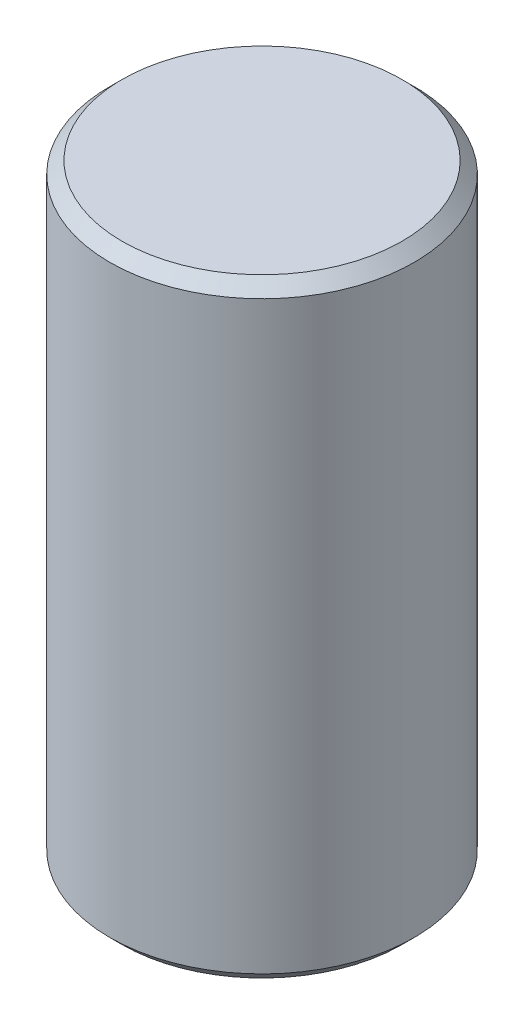
ISO-10303-21;
HEADER;
FILE_DESCRIPTION(('STEP AP214'),'2;1');
FILE_NAME('part.step','',(''),(''),'','','');
FILE_SCHEMA(('AUTOMOTIVE_DESIGN { 1 0 10303 214 1 1 1 1 }'));
ENDSEC;
DATA;
#1=APPLICATION_CONTEXT('core data for automotive mechanical design processes');
#2=APPLICATION_PROTOCOL_DEFINITION('international standard','automotive_design',2000,#1);
#3=PRODUCT_CONTEXT('',#1,'mechanical');
#4=PRODUCT('Part','Part','',(#3));
#5=PRODUCT_RELATED_PRODUCT_CATEGORY('part','',(#4));
#6=PRODUCT_DEFINITION_FORMATION('','',#4);
#7=PRODUCT_DEFINITION_CONTEXT('part definition',#1,'design');
#8=PRODUCT_DEFINITION('design','',#6,#7);
#9=PRODUCT_DEFINITION_SHAPE('','',#8);
#10=(LENGTH_UNIT() NAMED_UNIT(*) SI_UNIT(.MILLI.,.METRE.));
#11=(NAMED_UNIT(*) PLANE_ANGLE_UNIT() SI_UNIT($,.RADIAN.));
#12=(NAMED_UNIT(*) SI_UNIT($,.STERADIAN.) SOLID_ANGLE_UNIT());
#13=UNCERTAINTY_MEASURE_WITH_UNIT(LENGTH_MEASURE(1.E-05),#10,'distance_accuracy_value','');
#14=(GEOMETRIC_REPRESENTATION_CONTEXT(3) GLOBAL_UNCERTAINTY_ASSIGNED_CONTEXT((#13)) GLOBAL_UNIT_ASSIGNED_CONTEXT((#10,
#11,#12)) REPRESENTATION_CONTEXT('',''));
#15=CARTESIAN_POINT('',(0.,0.,0.));
#16=DIRECTION('',(0.,0.,1.));
#17=DIRECTION('',(1.,0.,0.));
#18=AXIS2_PLACEMENT_3D('',#15,#16,#17);
#19=CARTESIAN_POINT('',(0.,5.,0.));
#20=DIRECTION('',(0.,-1.,0.));
#21=DIRECTION('',(0.,0.,-1.));
#22=AXIS2_PLACEMENT_3D('',#19,#20,#21);
#23=CYLINDRICAL_SURFACE('',#22,1.25);
#24=CARTESIAN_POINT('',(0.,0.1,0.));
#25=DIRECTION('',(0.,1.,0.));
#26=DIRECTION('',(0.,0.,1.));
#27=AXIS2_PLACEMENT_3D('',#24,#25,#26);
#28=CIRCLE('',#27,1.25);
#29=CARTESIAN_POINT('',(0.,0.1,1.25));
#30=VERTEX_POINT('',#29);
#31=EDGE_CURVE('E45',#30,#30,#28,.T.);
#32=ORIENTED_EDGE('',*,*,#31,.T.);
#33=EDGE_LOOP('',(#32));
#34=FACE_BOUND('',#33,.T.);
#35=CARTESIAN_POINT('',(0.,4.9,0.));
#36=DIRECTION('',(0.,1.,0.));
#37=DIRECTION('',(0.,0.,1.));
#38=AXIS2_PLACEMENT_3D('',#35,#36,#37);
#39=CIRCLE('',#38,1.25);
#40=CARTESIAN_POINT('',(0.,4.9,1.25));
#41=VERTEX_POINT('',#40);
#42=EDGE_CURVE('E49',#41,#41,#39,.F.);
#43=ORIENTED_EDGE('',*,*,#42,.T.);
#44=EDGE_LOOP('',(#43));
#45=FACE_BOUND('',#44,.T.);
#46=ADVANCED_FACE('F33',(#34,#45),#23,.T.);
#47=CARTESIAN_POINT('',(0.,5.,0.));
#48=DIRECTION('',(0.,1.,0.));
#49=DIRECTION('',(0.,0.,1.));
#50=AXIS2_PLACEMENT_3D('',#47,#48,#49);
#51=PLANE('',#50);
#52=CARTESIAN_POINT('',(0.,5.,0.));
#53=DIRECTION('',(0.,1.,0.));
#54=DIRECTION('',(0.,0.,1.));
#55=AXIS2_PLACEMENT_3D('',#52,#53,#54);
#56=CIRCLE('',#55,1.15);
#57=CARTESIAN_POINT('',(0.,5.,1.15));
#58=VERTEX_POINT('',#57);
#59=EDGE_CURVE('E10',#58,#58,#56,.T.);
#60=ORIENTED_EDGE('',*,*,#59,.T.);
#61=EDGE_LOOP('',(#60));
#62=FACE_BOUND('',#61,.T.);
#63=ADVANCED_FACE('F65',(#62),#51,.T.);
#64=CARTESIAN_POINT('',(0.,0.,0.));
#65=DIRECTION('',(0.,1.,0.));
#66=DIRECTION('',(0.,0.,1.));
#67=AXIS2_PLACEMENT_3D('',#64,#65,#66);
#68=PLANE('',#67);
#69=CARTESIAN_POINT('',(0.,0.,0.));
#70=DIRECTION('',(0.,1.,0.));
#71=DIRECTION('',(0.,0.,1.));
#72=AXIS2_PLACEMENT_3D('',#69,#70,#71);
#73=CIRCLE('',#72,1.15);
#74=CARTESIAN_POINT('',(0.,0.,1.15));
#75=VERTEX_POINT('',#74);
#76=EDGE_CURVE('E41',#75,#75,#73,.F.);
#77=ORIENTED_EDGE('',*,*,#76,.T.);
#78=EDGE_LOOP('',(#77));
#79=FACE_BOUND('',#78,.T.);
#80=ADVANCED_FACE('F62',(#79),#68,.F.);
#81=CARTESIAN_POINT('',(0.,0.1,0.));
#82=DIRECTION('',(0.,1.,0.));
#83=DIRECTION('',(0.,0.,1.));
#84=AXIS2_PLACEMENT_3D('',#81,#82,#83);
#85=CONICAL_SURFACE('',#84,1.25,0.785398163397455);
#86=ORIENTED_EDGE('',*,*,#76,.F.);
#87=EDGE_LOOP('',(#86));
#88=FACE_BOUND('',#87,.T.);
#89=ORIENTED_EDGE('',*,*,#31,.F.);
#90=EDGE_LOOP('',(#89));
#91=FACE_BOUND('',#90,.T.);
#92=ADVANCED_FACE('F58',(#88,#91),#85,.T.);
#93=CARTESIAN_POINT('',(0.,5.,0.));
#94=DIRECTION('',(0.,-1.,0.));
#95=DIRECTION('',(0.,0.,-1.));
#96=AXIS2_PLACEMENT_3D('',#93,#94,#95);
#97=CONICAL_SURFACE('',#96,1.15,0.78539816339745);
#98=ORIENTED_EDGE('',*,*,#42,.F.);
#99=EDGE_LOOP('',(#98));
#100=FACE_BOUND('',#99,.T.);
#101=ORIENTED_EDGE('',*,*,#59,.F.);
#102=EDGE_LOOP('',(#101));
#103=FACE_BOUND('',#102,.T.);
#104=ADVANCED_FACE('F36',(#100,#103),#97,.T.);
#105=CLOSED_SHELL('',(#46,#63,#80,#92,#104));
#106=MANIFOLD_SOLID_BREP('B2',#105);
#107=ADVANCED_BREP_SHAPE_REPRESENTATION('',(#18,#106),#14);
#108=SHAPE_DEFINITION_REPRESENTATION(#9,#107);
ENDSEC;
END-ISO-10303-21;
